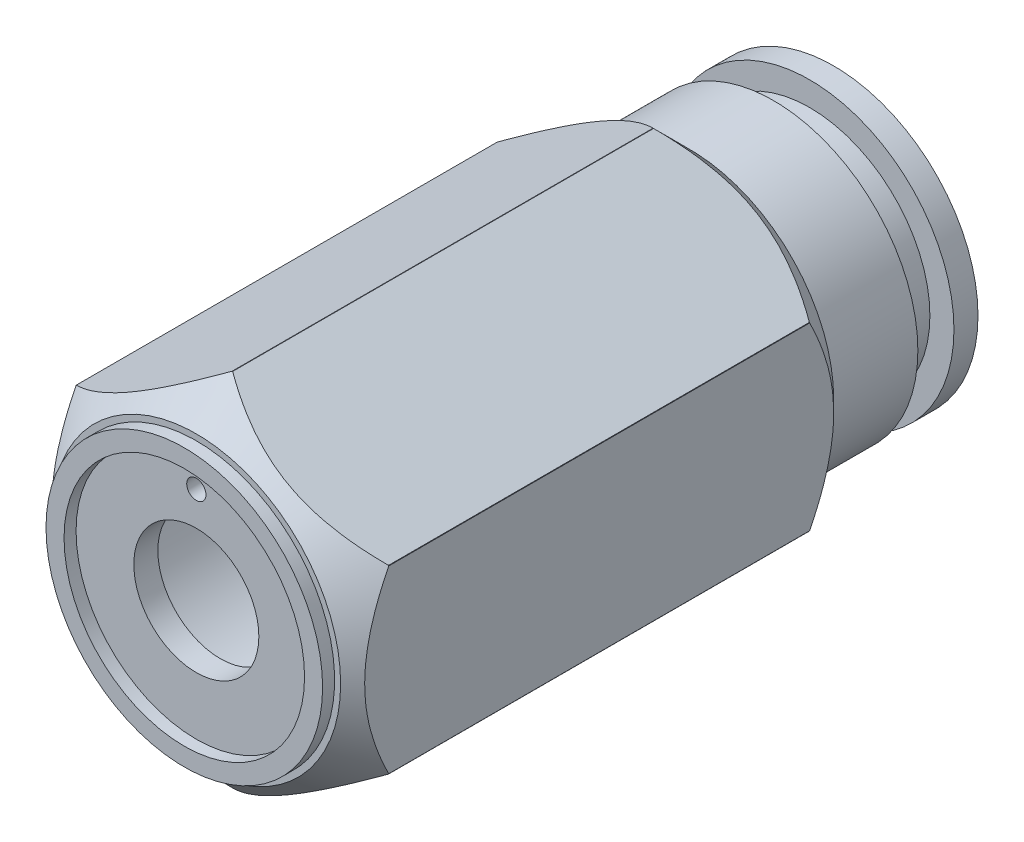
ISO-10303-21;
HEADER;
FILE_DESCRIPTION(('STEP AP214'),'2;1');
FILE_NAME('part.step','',(''),(''),'','','');
FILE_SCHEMA(('AUTOMOTIVE_DESIGN { 1 0 10303 214 1 1 1 1 }'));
ENDSEC;
DATA;
#1=APPLICATION_CONTEXT('core data for automotive mechanical design processes');
#2=APPLICATION_PROTOCOL_DEFINITION('international standard','automotive_design',2000,#1);
#3=PRODUCT_CONTEXT('',#1,'mechanical');
#4=PRODUCT('Part','Part','',(#3));
#5=PRODUCT_RELATED_PRODUCT_CATEGORY('part','',(#4));
#6=PRODUCT_DEFINITION_FORMATION('','',#4);
#7=PRODUCT_DEFINITION_CONTEXT('part definition',#1,'design');
#8=PRODUCT_DEFINITION('design','',#6,#7);
#9=PRODUCT_DEFINITION_SHAPE('','',#8);
#10=(LENGTH_UNIT() NAMED_UNIT(*) SI_UNIT(.MILLI.,.METRE.));
#11=(NAMED_UNIT(*) PLANE_ANGLE_UNIT() SI_UNIT($,.RADIAN.));
#12=(NAMED_UNIT(*) SI_UNIT($,.STERADIAN.) SOLID_ANGLE_UNIT());
#13=UNCERTAINTY_MEASURE_WITH_UNIT(LENGTH_MEASURE(1.E-05),#10,'distance_accuracy_value','');
#14=(GEOMETRIC_REPRESENTATION_CONTEXT(3) GLOBAL_UNCERTAINTY_ASSIGNED_CONTEXT((#13)) GLOBAL_UNIT_ASSIGNED_CONTEXT((#10,
#11,#12)) REPRESENTATION_CONTEXT('',''));
#15=CARTESIAN_POINT('',(0.,0.,0.));
#16=DIRECTION('',(0.,0.,1.));
#17=DIRECTION('',(1.,0.,0.));
#18=AXIS2_PLACEMENT_3D('',#15,#16,#17);
#19=CARTESIAN_POINT('',(0.,6.,-6.));
#20=DIRECTION('',(0.,0.,1.));
#21=DIRECTION('',(1.,0.,0.));
#22=AXIS2_PLACEMENT_3D('',#19,#20,#21);
#23=PLANE('',#22);
#24=CARTESIAN_POINT('',(0.,0.,-6.));
#25=DIRECTION('',(0.,0.,-1.));
#26=DIRECTION('',(-1.,0.,0.));
#27=AXIS2_PLACEMENT_3D('',#24,#25,#26);
#28=CIRCLE('',#27,2.5);
#29=CARTESIAN_POINT('',(-2.5,0.,-6.));
#30=VERTEX_POINT('',#29);
#31=EDGE_CURVE('E285',#30,#30,#28,.T.);
#32=ORIENTED_EDGE('',*,*,#31,.F.);
#33=EDGE_LOOP('',(#32));
#34=FACE_BOUND('',#33,.T.);
#35=CARTESIAN_POINT('',(0.,0.,-6.));
#36=DIRECTION('',(0.,0.,1.));
#37=DIRECTION('',(1.,0.,0.));
#38=AXIS2_PLACEMENT_3D('',#35,#36,#37);
#39=CIRCLE('',#38,6.);
#40=CARTESIAN_POINT('',(-6.,0.,-6.));
#41=VERTEX_POINT('',#40);
#42=EDGE_CURVE('E300',#41,#41,#39,.T.);
#43=ORIENTED_EDGE('',*,*,#42,.F.);
#44=EDGE_LOOP('',(#43));
#45=FACE_BOUND('',#44,.T.);
#46=ADVANCED_FACE('F16',(#34,#45),#23,.F.);
#47=CARTESIAN_POINT('',(0.,5.,-5.));
#48=DIRECTION('',(0.,0.,-1.));
#49=DIRECTION('',(0.,-1.,0.));
#50=AXIS2_PLACEMENT_3D('',#47,#48,#49);
#51=PLANE('',#50);
#52=CARTESIAN_POINT('',(0.,0.,-5.));
#53=DIRECTION('',(0.,0.,1.));
#54=DIRECTION('',(1.,0.,0.));
#55=AXIS2_PLACEMENT_3D('',#52,#53,#54);
#56=CIRCLE('',#55,5.);
#57=CARTESIAN_POINT('',(-5.,0.,-5.));
#58=VERTEX_POINT('',#57);
#59=EDGE_CURVE('E283',#58,#58,#56,.T.);
#60=ORIENTED_EDGE('',*,*,#59,.F.);
#61=EDGE_LOOP('',(#60));
#62=FACE_BOUND('',#61,.T.);
#63=CARTESIAN_POINT('',(0.,0.,-5.));
#64=DIRECTION('',(0.,0.,1.));
#65=DIRECTION('',(1.,0.,0.));
#66=AXIS2_PLACEMENT_3D('',#63,#64,#65);
#67=CIRCLE('',#66,6.);
#68=CARTESIAN_POINT('',(6.,0.,-5.));
#69=VERTEX_POINT('',#68);
#70=EDGE_CURVE('E286',#69,#69,#67,.T.);
#71=ORIENTED_EDGE('',*,*,#70,.T.);
#72=EDGE_LOOP('',(#71));
#73=FACE_BOUND('',#72,.T.);
#74=ADVANCED_FACE('F800',(#62,#73),#51,.F.);
#75=CARTESIAN_POINT('',(0.,6.,-3.5));
#76=DIRECTION('',(0.,0.,1.));
#77=DIRECTION('',(1.,0.,0.));
#78=AXIS2_PLACEMENT_3D('',#75,#76,#77);
#79=PLANE('',#78);
#80=CARTESIAN_POINT('',(0.,0.,-3.5));
#81=DIRECTION('',(0.,0.,1.));
#82=DIRECTION('',(1.,0.,0.));
#83=AXIS2_PLACEMENT_3D('',#80,#81,#82);
#84=CIRCLE('',#83,5.);
#85=CARTESIAN_POINT('',(5.,0.,-3.5));
#86=VERTEX_POINT('',#85);
#87=EDGE_CURVE('E251',#86,#86,#84,.T.);
#88=ORIENTED_EDGE('',*,*,#87,.T.);
#89=EDGE_LOOP('',(#88));
#90=FACE_BOUND('',#89,.T.);
#91=CARTESIAN_POINT('',(0.,0.,-3.5));
#92=DIRECTION('',(0.,0.,1.));
#93=DIRECTION('',(1.,0.,0.));
#94=AXIS2_PLACEMENT_3D('',#91,#92,#93);
#95=CIRCLE('',#94,6.);
#96=CARTESIAN_POINT('',(-6.,0.,-3.5));
#97=VERTEX_POINT('',#96);
#98=EDGE_CURVE('E242',#97,#97,#95,.T.);
#99=ORIENTED_EDGE('',*,*,#98,.F.);
#100=EDGE_LOOP('',(#99));
#101=FACE_BOUND('',#100,.T.);
#102=ADVANCED_FACE('F791',(#90,#101),#79,.F.);
#103=CARTESIAN_POINT('',(0.,-7.50555349946513,20.5));
#104=DIRECTION('',(0.5,0.866025403784438,0.));
#105=DIRECTION('',(0.,0.,-1.));
#106=AXIS2_PLACEMENT_3D('',#103,#104,#105);
#107=PLANE('',#106);
#108=CARTESIAN_POINT('',(-0.0096296507960727,-7.49999381798581,19.));
#109=CARTESIAN_POINT('',(-0.828912052166388,-7.02698090301234,19.4719606046267));
#110=CARTESIAN_POINT('',(-1.57034631152404,-6.59891363378579,19.7168113188353));
#111=CARTESIAN_POINT('',(-2.4215834395052,-6.10745164880166,19.9979232530581));
#112=CARTESIAN_POINT('',(-3.23817168564602,-5.63599420507518,19.9999856503727));
#113=CARTESIAN_POINT('',(-4.05526989250544,-5.16424233539053,20.002049335658));
#114=CARTESIAN_POINT('',(-4.90801836544974,-4.67190777498509,19.7239121512809));
#115=CARTESIAN_POINT('',(-5.65882494445944,-4.2384293944845,19.4790249019652));
#116=CARTESIAN_POINT('',(-6.49037034920392,-3.75833643121187,19.));
#117=B_SPLINE_CURVE_WITH_KNOTS('',2,(#108,#109,#110,#111,#112,#113,#114,#115,#116),
.UNSPECIFIED.,.F.,.F.,(3,2,2,2,3),(0.,0.25,0.5,0.75,1.),.UNSPECIFIED.);
#118=CARTESIAN_POINT('',(-0.0096296507960743,-7.49999381798582,19.));
#119=VERTEX_POINT('',#118);
#120=CARTESIAN_POINT('',(-6.49037034920393,-3.75833643121187,19.));
#121=VERTEX_POINT('',#120);
#122=EDGE_CURVE('E615',#119,#121,#117,.T.);
#123=ORIENTED_EDGE('',*,*,#122,.T.);
#124=DIRECTION('',(0.,0.,1.));
#125=VECTOR('',#124,1.);
#126=CARTESIAN_POINT('',(-6.49037034920393,-3.75833643121187,20.5));
#127=LINE('',#126,#125);
#128=CARTESIAN_POINT('',(-6.49037034920394,-3.75833643121187,1.5));
#129=VERTEX_POINT('',#128);
#130=EDGE_CURVE('E11',#129,#121,#127,.T.);
#131=ORIENTED_EDGE('',*,*,#130,.F.);
#132=CARTESIAN_POINT('',(-6.49037034920393,-3.75833643121187,1.5));
#133=CARTESIAN_POINT('',(-5.67108794781167,-4.23134934619801,1.0280393953607));
#134=CARTESIAN_POINT('',(-4.92965368847596,-4.6594166154119,0.783188681164702));
#135=CARTESIAN_POINT('',(-4.078416560476,-5.15087860040688,0.502076746941901));
#136=CARTESIAN_POINT('',(-3.26182831435399,-5.62233604412251,0.500014349627303));
#137=CARTESIAN_POINT('',(-2.4447301075046,-6.09408791380136,0.497950664342099));
#138=CARTESIAN_POINT('',(-1.59198163455027,-6.58642247421259,0.776087848719048));
#139=CARTESIAN_POINT('',(-0.841175055552183,-7.01990085470648,1.02097509802805));
#140=CARTESIAN_POINT('',(-0.00962965079607135,-7.49999381798582,1.5));
#141=B_SPLINE_CURVE_WITH_KNOTS('',2,(#132,#133,#134,#135,#136,#137,#138,#139,#140),
.UNSPECIFIED.,.F.,.F.,(3,2,2,2,3),(0.,0.25,0.5,0.75,1.),.UNSPECIFIED.);
#142=CARTESIAN_POINT('',(-0.00962965079607205,-7.49999381798582,1.5));
#143=VERTEX_POINT('',#142);
#144=EDGE_CURVE('E524',#129,#143,#141,.T.);
#145=ORIENTED_EDGE('',*,*,#144,.T.);
#146=DIRECTION('',(0.,0.,-1.));
#147=VECTOR('',#146,1.);
#148=CARTESIAN_POINT('',(-0.0096296507960743,-7.49999381798582,20.5));
#149=LINE('',#148,#147);
#150=EDGE_CURVE('E303',#119,#143,#149,.T.);
#151=ORIENTED_EDGE('',*,*,#150,.F.);
#152=EDGE_LOOP('',(#123,#131,#145,#151));
#153=FACE_BOUND('',#152,.T.);
#154=ADVANCED_FACE('F797',(#153),#107,.F.);
#155=CARTESIAN_POINT('',(0.,0.,20.5));
#156=DIRECTION('',(0.,0.,-1.));
#157=DIRECTION('',(-1.,0.,0.));
#158=AXIS2_PLACEMENT_3D('',#155,#156,#157);
#159=CYLINDRICAL_SURFACE('',#158,7.5);
#160=CARTESIAN_POINT('',(0.,0.,1.5));
#161=DIRECTION('',(0.,0.,1.));
#162=DIRECTION('',(1.,0.,0.));
#163=AXIS2_PLACEMENT_3D('',#160,#161,#162);
#164=CIRCLE('',#163,7.5);
#165=CARTESIAN_POINT('',(-6.5,-3.74165738677395,1.5));
#166=VERTEX_POINT('',#165);
#167=EDGE_CURVE('E519',#166,#129,#164,.T.);
#168=ORIENTED_EDGE('',*,*,#167,.T.);
#169=ORIENTED_EDGE('',*,*,#130,.T.);
#170=CARTESIAN_POINT('',(0.,0.,19.));
#171=DIRECTION('',(0.,0.,-1.));
#172=DIRECTION('',(1.,0.,0.));
#173=AXIS2_PLACEMENT_3D('',#170,#171,#172);
#174=CIRCLE('',#173,7.5);
#175=CARTESIAN_POINT('',(-6.5,-3.74165738677395,19.));
#176=VERTEX_POINT('',#175);
#177=EDGE_CURVE('E518',#121,#176,#174,.T.);
#178=ORIENTED_EDGE('',*,*,#177,.T.);
#179=DIRECTION('',(0.,0.,-1.));
#180=VECTOR('',#179,1.);
#181=CARTESIAN_POINT('',(-6.5,-3.74165738677395,20.5));
#182=LINE('',#181,#180);
#183=EDGE_CURVE('E26',#176,#166,#182,.T.);
#184=ORIENTED_EDGE('',*,*,#183,.T.);
#185=EDGE_LOOP('',(#168,#169,#178,#184));
#186=FACE_BOUND('',#185,.T.);
#187=ADVANCED_FACE('F836',(#186),#159,.T.);
#188=CARTESIAN_POINT('',(-6.5,-3.75277674973256,20.5));
#189=DIRECTION('',(1.,0.,0.));
#190=DIRECTION('',(0.,1.,0.));
#191=AXIS2_PLACEMENT_3D('',#188,#189,#190);
#192=PLANE('',#191);
#193=CARTESIAN_POINT('',(-6.5,-3.74165738677395,19.));
#194=CARTESIAN_POINT('',(-6.5,-2.78837203152614,19.4755822921555));
#195=CARTESIAN_POINT('',(-6.5,-1.92613583685732,19.7206195517565));
#196=CARTESIAN_POINT('',(-6.5,-0.943052958153085,20.));
#197=CARTESIAN_POINT('',(-6.5,0.,20.));
#198=B_SPLINE_CURVE_WITH_KNOTS('',2,(#193,#194,#195,#196,#197),.UNSPECIFIED.,.F.,.F.,(3,2,3),
(0.,0.5,1.),.UNSPECIFIED.);
#199=CARTESIAN_POINT('',(-6.5,0.,20.));
#200=VERTEX_POINT('',#199);
#201=EDGE_CURVE('E513',#176,#200,#198,.T.);
#202=ORIENTED_EDGE('',*,*,#201,.T.);
#203=CARTESIAN_POINT('',(-6.5,0.,20.));
#204=CARTESIAN_POINT('',(-6.5,0.942559457346275,20.));
#205=CARTESIAN_POINT('',(-6.5,1.92613782088363,19.7206189880611));
#206=CARTESIAN_POINT('',(-6.5,2.78779977404503,19.4758677843463));
#207=CARTESIAN_POINT('',(-6.5,3.74165738677394,19.));
#208=B_SPLINE_CURVE_WITH_KNOTS('',2,(#203,#204,#205,#206,#207),.UNSPECIFIED.,.F.,.F.,(3,2,3),
(0.,0.5,1.),.UNSPECIFIED.);
#209=CARTESIAN_POINT('',(-6.5,3.74165738677395,19.));
#210=VERTEX_POINT('',#209);
#211=EDGE_CURVE('E274',#200,#210,#208,.T.);
#212=ORIENTED_EDGE('',*,*,#211,.T.);
#213=DIRECTION('',(0.,0.,1.));
#214=VECTOR('',#213,1.);
#215=CARTESIAN_POINT('',(-6.5,3.74165738677395,20.5));
#216=LINE('',#215,#214);
#217=CARTESIAN_POINT('',(-6.5,3.74165738677395,1.5));
#218=VERTEX_POINT('',#217);
#219=EDGE_CURVE('E586',#218,#210,#216,.T.);
#220=ORIENTED_EDGE('',*,*,#219,.F.);
#221=CARTESIAN_POINT('',(-6.5,3.74165738677394,1.5));
#222=CARTESIAN_POINT('',(-6.5,2.78837517871614,1.0244192779387));
#223=CARTESIAN_POINT('',(-6.5,1.92613782088361,0.779381011938952));
#224=CARTESIAN_POINT('',(-6.5,0.943055670102145,0.5));
#225=CARTESIAN_POINT('',(-6.5,0.,0.5));
#226=B_SPLINE_CURVE_WITH_KNOTS('',2,(#221,#222,#223,#224,#225),.UNSPECIFIED.,.F.,.F.,(3,2,3),
(0.,0.5,1.),.UNSPECIFIED.);
#227=CARTESIAN_POINT('',(-6.5,0.,0.5));
#228=VERTEX_POINT('',#227);
#229=EDGE_CURVE('E651',#218,#228,#226,.T.);
#230=ORIENTED_EDGE('',*,*,#229,.T.);
#231=CARTESIAN_POINT('',(-6.5,0.,0.5));
#232=CARTESIAN_POINT('',(-6.5,-0.942560930474805,0.5));
#233=CARTESIAN_POINT('',(-6.5,-1.92613583685731,0.779380448243501));
#234=CARTESIAN_POINT('',(-6.5,-2.78780147904892,1.024133066259));
#235=CARTESIAN_POINT('',(-6.5,-3.74165738677395,1.5));
#236=B_SPLINE_CURVE_WITH_KNOTS('',2,(#231,#232,#233,#234,#235),.UNSPECIFIED.,.F.,.F.,(3,2,3),
(0.,0.5,1.),.UNSPECIFIED.);
#237=EDGE_CURVE('E522',#228,#166,#236,.T.);
#238=ORIENTED_EDGE('',*,*,#237,.T.);
#239=ORIENTED_EDGE('',*,*,#183,.F.);
#240=EDGE_LOOP('',(#202,#212,#220,#230,#238,#239));
#241=FACE_BOUND('',#240,.T.);
#242=ADVANCED_FACE('F844',(#241),#192,.F.);
#243=CARTESIAN_POINT('',(0.,0.,20.5));
#244=DIRECTION('',(0.,0.,-1.));
#245=DIRECTION('',(-1.,0.,0.));
#246=AXIS2_PLACEMENT_3D('',#243,#244,#245);
#247=CYLINDRICAL_SURFACE('',#246,7.5);
#248=CARTESIAN_POINT('',(0.,0.,19.));
#249=DIRECTION('',(0.,0.,-1.));
#250=DIRECTION('',(1.,0.,0.));
#251=AXIS2_PLACEMENT_3D('',#248,#249,#250);
#252=CIRCLE('',#251,7.5);
#253=CARTESIAN_POINT('',(-6.49037034920393,3.75833643121187,19.));
#254=VERTEX_POINT('',#253);
#255=EDGE_CURVE('E293',#210,#254,#252,.T.);
#256=ORIENTED_EDGE('',*,*,#255,.T.);
#257=DIRECTION('',(0.,0.,-1.));
#258=VECTOR('',#257,1.);
#259=CARTESIAN_POINT('',(-6.49037034920393,3.75833643121187,20.5));
#260=LINE('',#259,#258);
#261=CARTESIAN_POINT('',(-6.49037034920393,3.75833643121187,1.5));
#262=VERTEX_POINT('',#261);
#263=EDGE_CURVE('E193',#254,#262,#260,.T.);
#264=ORIENTED_EDGE('',*,*,#263,.T.);
#265=CARTESIAN_POINT('',(0.,0.,1.5));
#266=DIRECTION('',(0.,0.,1.));
#267=DIRECTION('',(1.,0.,0.));
#268=AXIS2_PLACEMENT_3D('',#265,#266,#267);
#269=CIRCLE('',#268,7.5);
#270=EDGE_CURVE('E351',#262,#218,#269,.T.);
#271=ORIENTED_EDGE('',*,*,#270,.T.);
#272=ORIENTED_EDGE('',*,*,#219,.T.);
#273=EDGE_LOOP('',(#256,#264,#271,#272));
#274=FACE_BOUND('',#273,.T.);
#275=ADVANCED_FACE('F18',(#274),#247,.T.);
#276=CARTESIAN_POINT('',(-6.5,3.75277674973256,20.5));
#277=DIRECTION('',(0.5,-0.866025403784439,0.));
#278=DIRECTION('',(0.,0.,-1.));
#279=AXIS2_PLACEMENT_3D('',#276,#277,#278);
#280=PLANE('',#279);
#281=CARTESIAN_POINT('',(-6.49037034920394,3.75833643121187,19.));
#282=CARTESIAN_POINT('',(-5.67108794782176,4.2313493461922,19.4719606046335));
#283=CARTESIAN_POINT('',(-4.92965368847596,4.6594166154119,19.7168113188353));
#284=CARTESIAN_POINT('',(-4.07841656048468,5.15087860040188,19.9979232530581));
#285=CARTESIAN_POINT('',(-3.26182831435399,5.62233604412252,19.9999856503727));
#286=CARTESIAN_POINT('',(-2.44473010749523,6.09408791380678,20.0020493356579));
#287=CARTESIAN_POINT('',(-1.59198163455027,6.58642247421259,19.7239121512809));
#288=CARTESIAN_POINT('',(-0.841175055541357,7.01990085471273,19.4790249019657));
#289=CARTESIAN_POINT('',(-0.00962965079606692,7.49999381798582,19.));
#290=B_SPLINE_CURVE_WITH_KNOTS('',2,(#281,#282,#283,#284,#285,#286,#287,#288,#289),
.UNSPECIFIED.,.F.,.F.,(3,2,2,2,3),(0.,0.25,0.5,0.75,1.),.UNSPECIFIED.);
#291=CARTESIAN_POINT('',(-0.00962965079606172,7.49999381798582,19.));
#292=VERTEX_POINT('',#291);
#293=EDGE_CURVE('E306',#254,#292,#290,.T.);
#294=ORIENTED_EDGE('',*,*,#293,.T.);
#295=DIRECTION('',(0.,0.,1.));
#296=VECTOR('',#295,1.);
#297=CARTESIAN_POINT('',(-0.00962965079606172,7.49999381798582,20.5));
#298=LINE('',#297,#296);
#299=CARTESIAN_POINT('',(-0.00962965079606649,7.49999381798582,1.5));
#300=VERTEX_POINT('',#299);
#301=EDGE_CURVE('E182',#300,#292,#298,.T.);
#302=ORIENTED_EDGE('',*,*,#301,.F.);
#303=CARTESIAN_POINT('',(-0.00962965079606692,7.49999381798582,1.5));
#304=CARTESIAN_POINT('',(-0.828912052190848,7.02698090299822,1.02803939535925));
#305=CARTESIAN_POINT('',(-1.57034631152404,6.59891363378579,0.783188681164702));
#306=CARTESIAN_POINT('',(-2.42158343953541,6.10745164878422,0.502076746938852));
#307=CARTESIAN_POINT('',(-3.23817168564602,5.63599420507518,0.500014349627303));
#308=CARTESIAN_POINT('',(-4.05526989251348,5.16424233538589,0.497950664345052));
#309=CARTESIAN_POINT('',(-4.90801836544974,4.6719077749851,0.776087848719048));
#310=CARTESIAN_POINT('',(-5.6588249444581,4.23842939448528,1.020975098034));
#311=CARTESIAN_POINT('',(-6.49037034920394,3.75833643121187,1.5));
#312=B_SPLINE_CURVE_WITH_KNOTS('',2,(#303,#304,#305,#306,#307,#308,#309,#310,#311),
.UNSPECIFIED.,.F.,.F.,(3,2,2,2,3),(0.,0.25,0.5,0.75,1.),.UNSPECIFIED.);
#313=EDGE_CURVE('E350',#300,#262,#312,.T.);
#314=ORIENTED_EDGE('',*,*,#313,.T.);
#315=ORIENTED_EDGE('',*,*,#263,.F.);
#316=EDGE_LOOP('',(#294,#302,#314,#315));
#317=FACE_BOUND('',#316,.T.);
#318=ADVANCED_FACE('F317',(#317),#280,.F.);
#319=CARTESIAN_POINT('',(0.,0.,20.5));
#320=DIRECTION('',(0.,0.,-1.));
#321=DIRECTION('',(-1.,0.,0.));
#322=AXIS2_PLACEMENT_3D('',#319,#320,#321);
#323=CYLINDRICAL_SURFACE('',#322,7.5);
#324=CARTESIAN_POINT('',(0.,0.,19.));
#325=DIRECTION('',(0.,0.,-1.));
#326=DIRECTION('',(1.,4.06785716222658E-13,0.));
#327=AXIS2_PLACEMENT_3D('',#324,#325,#326);
#328=CIRCLE('',#327,7.5);
#329=CARTESIAN_POINT('',(0.00962965079606822,7.49999381798582,19.));
#330=VERTEX_POINT('',#329);
#331=EDGE_CURVE('E536',#292,#330,#328,.T.);
#332=ORIENTED_EDGE('',*,*,#331,.T.);
#333=DIRECTION('',(0.,0.,-1.));
#334=VECTOR('',#333,1.);
#335=CARTESIAN_POINT('',(0.00962965079606822,7.49999381798582,20.5));
#336=LINE('',#335,#334);
#337=CARTESIAN_POINT('',(0.00962965079606612,7.49999381798582,1.5));
#338=VERTEX_POINT('',#337);
#339=EDGE_CURVE('E626',#330,#338,#336,.T.);
#340=ORIENTED_EDGE('',*,*,#339,.T.);
#341=CARTESIAN_POINT('',(0.,0.,1.5));
#342=DIRECTION('',(0.,0.,1.));
#343=DIRECTION('',(1.,0.,0.));
#344=AXIS2_PLACEMENT_3D('',#341,#342,#343);
#345=CIRCLE('',#344,7.5);
#346=EDGE_CURVE('E596',#338,#300,#345,.T.);
#347=ORIENTED_EDGE('',*,*,#346,.T.);
#348=ORIENTED_EDGE('',*,*,#301,.T.);
#349=EDGE_LOOP('',(#332,#340,#347,#348));
#350=FACE_BOUND('',#349,.T.);
#351=ADVANCED_FACE('F327',(#350),#323,.T.);
#352=CARTESIAN_POINT('',(0.,7.50555349946513,20.5));
#353=DIRECTION('',(-0.5,-0.866025403784439,0.));
#354=DIRECTION('',(-0.866025403784439,0.5,0.));
#355=AXIS2_PLACEMENT_3D('',#352,#353,#354);
#356=PLANE('',#355);
#357=CARTESIAN_POINT('',(0.00962965079606796,7.49999381798582,19.));
#358=CARTESIAN_POINT('',(0.828912052177772,7.02698090300577,19.4719606046332));
#359=CARTESIAN_POINT('',(1.57034631152404,6.59891363378579,19.7168113188353));
#360=CARTESIAN_POINT('',(2.42158343952416,6.10745164879072,19.9979232530611));
#361=CARTESIAN_POINT('',(3.23817168564601,5.63599420507518,19.9999856503727));
#362=CARTESIAN_POINT('',(4.0552698925133,5.16424233538599,20.0020493356549));
#363=CARTESIAN_POINT('',(4.90801836544974,4.67190777498509,19.7239121512809));
#364=CARTESIAN_POINT('',(5.65882494445791,4.23842939448538,19.4790249019661));
#365=CARTESIAN_POINT('',(6.49037034920393,3.75833643121187,19.));
#366=B_SPLINE_CURVE_WITH_KNOTS('',2,(#357,#358,#359,#360,#361,#362,#363,#364,#365),
.UNSPECIFIED.,.F.,.F.,(3,2,2,2,3),(0.,0.25,0.5,0.75,1.),.UNSPECIFIED.);
#367=CARTESIAN_POINT('',(6.49037034920393,3.75833643121187,19.));
#368=VERTEX_POINT('',#367);
#369=EDGE_CURVE('E544',#330,#368,#366,.T.);
#370=ORIENTED_EDGE('',*,*,#369,.T.);
#371=DIRECTION('',(0.,0.,1.));
#372=VECTOR('',#371,1.);
#373=CARTESIAN_POINT('',(6.49037034920393,3.75833643121187,20.5));
#374=LINE('',#373,#372);
#375=CARTESIAN_POINT('',(6.49037034920394,3.75833643121187,1.5));
#376=VERTEX_POINT('',#375);
#377=EDGE_CURVE('E494',#376,#368,#374,.T.);
#378=ORIENTED_EDGE('',*,*,#377,.F.);
#379=CARTESIAN_POINT('',(6.49037034920394,3.75833643121187,1.49999999999999));
#380=CARTESIAN_POINT('',(5.67108794782093,4.23134934619268,1.02803939536604));
#381=CARTESIAN_POINT('',(4.92965368847597,4.6594166154119,0.783188681164691));
#382=CARTESIAN_POINT('',(4.07841656048399,5.15087860040227,0.502076746941939));
#383=CARTESIAN_POINT('',(3.26182831435399,5.62233604412251,0.500014349627292));
#384=CARTESIAN_POINT('',(2.44473010749558,6.09408791380657,0.49795066434204));
#385=CARTESIAN_POINT('',(1.59198163455027,6.58642247421259,0.776087848719038));
#386=CARTESIAN_POINT('',(0.841175055541698,7.01990085471253,1.0209750980341));
#387=CARTESIAN_POINT('',(0.00962965079606642,7.49999381798582,1.49999999999999));
#388=B_SPLINE_CURVE_WITH_KNOTS('',2,(#379,#380,#381,#382,#383,#384,#385,#386,#387),
.UNSPECIFIED.,.F.,.F.,(3,2,2,2,3),(0.,0.25,0.5,0.75,1.),.UNSPECIFIED.);
#389=EDGE_CURVE('E594',#376,#338,#388,.T.);
#390=ORIENTED_EDGE('',*,*,#389,.T.);
#391=ORIENTED_EDGE('',*,*,#339,.F.);
#392=EDGE_LOOP('',(#370,#378,#390,#391));
#393=FACE_BOUND('',#392,.T.);
#394=ADVANCED_FACE('F871',(#393),#356,.F.);
#395=CARTESIAN_POINT('',(0.,0.,20.5));
#396=DIRECTION('',(0.,0.,-1.));
#397=DIRECTION('',(-1.,0.,0.));
#398=AXIS2_PLACEMENT_3D('',#395,#396,#397);
#399=CYLINDRICAL_SURFACE('',#398,7.5);
#400=CARTESIAN_POINT('',(0.,0.,19.));
#401=DIRECTION('',(0.,0.,-1.));
#402=DIRECTION('',(1.,4.9826809345177E-13,0.));
#403=AXIS2_PLACEMENT_3D('',#400,#401,#402);
#404=CIRCLE('',#403,7.5);
#405=CARTESIAN_POINT('',(6.5,3.74165738677395,19.));
#406=VERTEX_POINT('',#405);
#407=EDGE_CURVE('E533',#368,#406,#404,.T.);
#408=ORIENTED_EDGE('',*,*,#407,.T.);
#409=DIRECTION('',(0.,0.,-1.));
#410=VECTOR('',#409,1.);
#411=CARTESIAN_POINT('',(6.5,3.74165738677395,20.5));
#412=LINE('',#411,#410);
#413=CARTESIAN_POINT('',(6.5,3.74165738677395,1.5));
#414=VERTEX_POINT('',#413);
#415=EDGE_CURVE('E489',#406,#414,#412,.T.);
#416=ORIENTED_EDGE('',*,*,#415,.T.);
#417=CARTESIAN_POINT('',(0.,0.,1.5));
#418=DIRECTION('',(0.,0.,1.));
#419=DIRECTION('',(1.,0.,0.));
#420=AXIS2_PLACEMENT_3D('',#417,#418,#419);
#421=CIRCLE('',#420,7.5);
#422=EDGE_CURVE('E278',#414,#376,#421,.T.);
#423=ORIENTED_EDGE('',*,*,#422,.T.);
#424=ORIENTED_EDGE('',*,*,#377,.T.);
#425=EDGE_LOOP('',(#408,#416,#423,#424));
#426=FACE_BOUND('',#425,.T.);
#427=ADVANCED_FACE('F423',(#426),#399,.T.);
#428=CARTESIAN_POINT('',(6.5,3.75277674973256,20.5));
#429=DIRECTION('',(-1.,0.,0.));
#430=DIRECTION('',(0.,0.,1.));
#431=AXIS2_PLACEMENT_3D('',#428,#429,#430);
#432=PLANE('',#431);
#433=CARTESIAN_POINT('',(6.5,3.74165738677395,19.));
#434=CARTESIAN_POINT('',(6.5,2.78837517872898,19.4755807220549));
#435=CARTESIAN_POINT('',(6.5,1.92613782088362,19.7206189880611));
#436=CARTESIAN_POINT('',(6.5,0.943055670113235,20.));
#437=CARTESIAN_POINT('',(6.5,0.,20.));
#438=B_SPLINE_CURVE_WITH_KNOTS('',2,(#433,#434,#435,#436,#437),.UNSPECIFIED.,.F.,.F.,(3,2,3),
(0.,0.5,1.),.UNSPECIFIED.);
#439=CARTESIAN_POINT('',(6.5,0.,20.));
#440=VERTEX_POINT('',#439);
#441=EDGE_CURVE('E529',#406,#440,#438,.T.);
#442=ORIENTED_EDGE('',*,*,#441,.T.);
#443=CARTESIAN_POINT('',(6.5,0.,20.));
#444=CARTESIAN_POINT('',(6.5,-0.942560930474175,20.));
#445=CARTESIAN_POINT('',(6.5,-1.92613583685732,19.7206195517565));
#446=CARTESIAN_POINT('',(6.5,-2.78780147904814,19.4758669337414));
#447=CARTESIAN_POINT('',(6.5,-3.74165738677394,19.));
#448=B_SPLINE_CURVE_WITH_KNOTS('',2,(#443,#444,#445,#446,#447),.UNSPECIFIED.,.F.,.F.,(3,2,3),
(0.,0.5,1.),.UNSPECIFIED.);
#449=CARTESIAN_POINT('',(6.5,-3.74165738677395,19.));
#450=VERTEX_POINT('',#449);
#451=EDGE_CURVE('E534',#440,#450,#448,.T.);
#452=ORIENTED_EDGE('',*,*,#451,.T.);
#453=DIRECTION('',(0.,0.,1.));
#454=VECTOR('',#453,1.);
#455=CARTESIAN_POINT('',(6.5,-3.74165738677395,20.5));
#456=LINE('',#455,#454);
#457=CARTESIAN_POINT('',(6.5,-3.74165738677395,1.5));
#458=VERTEX_POINT('',#457);
#459=EDGE_CURVE('E467',#458,#450,#456,.T.);
#460=ORIENTED_EDGE('',*,*,#459,.F.);
#461=CARTESIAN_POINT('',(6.5,-3.74165738677394,1.5));
#462=CARTESIAN_POINT('',(6.5,-2.78837203152661,1.0244177078447));
#463=CARTESIAN_POINT('',(6.5,-1.92613583685731,0.779380448243501));
#464=CARTESIAN_POINT('',(6.5,-0.943052958153506,0.5));
#465=CARTESIAN_POINT('',(6.5,0.,0.5));
#466=B_SPLINE_CURVE_WITH_KNOTS('',2,(#461,#462,#463,#464,#465),.UNSPECIFIED.,.F.,.F.,(3,2,3),
(0.,0.5,1.),.UNSPECIFIED.);
#467=CARTESIAN_POINT('',(6.5,0.,0.5));
#468=VERTEX_POINT('',#467);
#469=EDGE_CURVE('E248',#458,#468,#466,.T.);
#470=ORIENTED_EDGE('',*,*,#469,.T.);
#471=CARTESIAN_POINT('',(6.5,0.,0.5));
#472=CARTESIAN_POINT('',(6.5,0.942559457346085,0.5));
#473=CARTESIAN_POINT('',(6.5,1.92613782088362,0.779381011938952));
#474=CARTESIAN_POINT('',(6.5,2.78779977404496,1.0241322156536));
#475=CARTESIAN_POINT('',(6.5,3.74165738677395,1.5));
#476=B_SPLINE_CURVE_WITH_KNOTS('',2,(#471,#472,#473,#474,#475),.UNSPECIFIED.,.F.,.F.,(3,2,3),
(0.,0.5,1.),.UNSPECIFIED.);
#477=EDGE_CURVE('E241',#468,#414,#476,.T.);
#478=ORIENTED_EDGE('',*,*,#477,.T.);
#479=ORIENTED_EDGE('',*,*,#415,.F.);
#480=EDGE_LOOP('',(#442,#452,#460,#470,#478,#479));
#481=FACE_BOUND('',#480,.T.);
#482=ADVANCED_FACE('F413',(#481),#432,.F.);
#483=CARTESIAN_POINT('',(0.,0.,20.5));
#484=DIRECTION('',(0.,0.,-1.));
#485=DIRECTION('',(-1.,0.,0.));
#486=AXIS2_PLACEMENT_3D('',#483,#484,#485);
#487=CYLINDRICAL_SURFACE('',#486,7.5);
#488=CARTESIAN_POINT('',(0.,0.,19.));
#489=DIRECTION('',(0.,0.,-1.));
#490=DIRECTION('',(1.,0.,0.));
#491=AXIS2_PLACEMENT_3D('',#488,#489,#490);
#492=CIRCLE('',#491,7.5);
#493=CARTESIAN_POINT('',(6.49037034920393,-3.75833643121188,19.));
#494=VERTEX_POINT('',#493);
#495=EDGE_CURVE('E567',#450,#494,#492,.T.);
#496=ORIENTED_EDGE('',*,*,#495,.T.);
#497=DIRECTION('',(0.,0.,-1.));
#498=VECTOR('',#497,1.);
#499=CARTESIAN_POINT('',(6.49037034920393,-3.75833643121188,20.5));
#500=LINE('',#499,#498);
#501=CARTESIAN_POINT('',(6.49037034920393,-3.75833643121188,1.5));
#502=VERTEX_POINT('',#501);
#503=EDGE_CURVE('E471',#494,#502,#500,.T.);
#504=ORIENTED_EDGE('',*,*,#503,.T.);
#505=CARTESIAN_POINT('',(0.,0.,1.5));
#506=DIRECTION('',(0.,0.,1.));
#507=DIRECTION('',(1.,0.,0.));
#508=AXIS2_PLACEMENT_3D('',#505,#506,#507);
#509=CIRCLE('',#508,7.5);
#510=EDGE_CURVE('E448',#502,#458,#509,.T.);
#511=ORIENTED_EDGE('',*,*,#510,.T.);
#512=ORIENTED_EDGE('',*,*,#459,.T.);
#513=EDGE_LOOP('',(#496,#504,#511,#512));
#514=FACE_BOUND('',#513,.T.);
#515=ADVANCED_FACE('F424',(#514),#487,.T.);
#516=CARTESIAN_POINT('',(6.5,-3.75277674973257,20.5));
#517=DIRECTION('',(-0.5,0.866025403784439,0.));
#518=DIRECTION('',(0.,0.,1.));
#519=AXIS2_PLACEMENT_3D('',#516,#517,#518);
#520=PLANE('',#519);
#521=CARTESIAN_POINT('',(6.49037034920393,-3.75833643121188,19.));
#522=CARTESIAN_POINT('',(5.67108794780871,-4.23134934619973,19.471960604641));
#523=CARTESIAN_POINT('',(4.92965368847596,-4.65941661541191,19.7168113188353));
#524=CARTESIAN_POINT('',(4.07841656047344,-5.15087860040837,19.9979232530581));
#525=CARTESIAN_POINT('',(3.26182831435399,-5.62233604412252,19.9999856503727));
#526=CARTESIAN_POINT('',(2.44473010750446,-6.09408791380145,20.0020493356579));
#527=CARTESIAN_POINT('',(1.59198163455027,-6.5864224742126,19.7239121512809));
#528=CARTESIAN_POINT('',(0.841175055551966,-7.01990085470661,19.4790249019718));
#529=CARTESIAN_POINT('',(0.00962965079607473,-7.49999381798582,19.));
#530=B_SPLINE_CURVE_WITH_KNOTS('',2,(#521,#522,#523,#524,#525,#526,#527,#528,#529),
.UNSPECIFIED.,.F.,.F.,(3,2,2,2,3),(0.,0.25,0.5,0.75,1.),.UNSPECIFIED.);
#531=CARTESIAN_POINT('',(0.00962965079607473,-7.49999381798582,19.));
#532=VERTEX_POINT('',#531);
#533=EDGE_CURVE('E573',#494,#532,#530,.T.);
#534=ORIENTED_EDGE('',*,*,#533,.T.);
#535=DIRECTION('',(0.,0.,1.));
#536=VECTOR('',#535,1.);
#537=CARTESIAN_POINT('',(0.00962965079607473,-7.49999381798582,20.5));
#538=LINE('',#537,#536);
#539=CARTESIAN_POINT('',(0.00962965079607386,-7.49999381798582,1.5));
#540=VERTEX_POINT('',#539);
#541=EDGE_CURVE('E472',#540,#532,#538,.T.);
#542=ORIENTED_EDGE('',*,*,#541,.F.);
#543=CARTESIAN_POINT('',(0.00962965079607473,-7.49999381798582,1.5));
#544=CARTESIAN_POINT('',(0.828912052177381,-7.026980903006,1.028039395367));
#545=CARTESIAN_POINT('',(1.57034631152404,-6.59891363378579,0.783188681164702));
#546=CARTESIAN_POINT('',(2.42158343951458,-6.10745164879625,0.50207674694195));
#547=CARTESIAN_POINT('',(3.23817168564602,-5.63599420507518,0.500014349627303));
#548=CARTESIAN_POINT('',(4.05526989249418,-5.16424233539704,0.497950664342099));
#549=CARTESIAN_POINT('',(4.90801836544974,-4.67190777498511,0.776087848719048));
#550=CARTESIAN_POINT('',(5.6588249444464,-4.23842939449204,1.02097509802725));
#551=CARTESIAN_POINT('',(6.49037034920393,-3.75833643121188,1.5));
#552=B_SPLINE_CURVE_WITH_KNOTS('',2,(#543,#544,#545,#546,#547,#548,#549,#550,#551),
.UNSPECIFIED.,.F.,.F.,(3,2,2,2,3),(0.,0.25,0.5,0.75,1.),.UNSPECIFIED.);
#553=EDGE_CURVE('E452',#540,#502,#552,.T.);
#554=ORIENTED_EDGE('',*,*,#553,.T.);
#555=ORIENTED_EDGE('',*,*,#503,.F.);
#556=EDGE_LOOP('',(#534,#542,#554,#555));
#557=FACE_BOUND('',#556,.T.);
#558=ADVANCED_FACE('F829',(#557),#520,.F.);
#559=CARTESIAN_POINT('',(0.,0.,20.5));
#560=DIRECTION('',(0.,0.,-1.));
#561=DIRECTION('',(-1.,0.,0.));
#562=AXIS2_PLACEMENT_3D('',#559,#560,#561);
#563=CYLINDRICAL_SURFACE('',#562,7.5);
#564=CARTESIAN_POINT('',(0.,0.,19.));
#565=DIRECTION('',(0.,0.,-1.));
#566=DIRECTION('',(1.,0.,0.));
#567=AXIS2_PLACEMENT_3D('',#564,#565,#566);
#568=CIRCLE('',#567,7.5);
#569=EDGE_CURVE('E619',#532,#119,#568,.T.);
#570=ORIENTED_EDGE('',*,*,#569,.T.);
#571=ORIENTED_EDGE('',*,*,#150,.T.);
#572=CARTESIAN_POINT('',(0.,0.,1.5));
#573=DIRECTION('',(0.,0.,1.));
#574=DIRECTION('',(1.,0.,0.));
#575=AXIS2_PLACEMENT_3D('',#572,#573,#574);
#576=CIRCLE('',#575,7.5);
#577=EDGE_CURVE('E459',#143,#540,#576,.T.);
#578=ORIENTED_EDGE('',*,*,#577,.T.);
#579=ORIENTED_EDGE('',*,*,#541,.T.);
#580=EDGE_LOOP('',(#570,#571,#578,#579));
#581=FACE_BOUND('',#580,.T.);
#582=ADVANCED_FACE('F790',(#581),#563,.T.);
#583=CARTESIAN_POINT('',(0.,0.,8.5));
#584=DIRECTION('',(0.,0.,1.));
#585=DIRECTION('',(1.,0.,0.));
#586=AXIS2_PLACEMENT_3D('',#583,#584,#585);
#587=PLANE('',#586);
#588=CARTESIAN_POINT('',(0.,0.,8.5));
#589=DIRECTION('',(0.,0.,-1.));
#590=DIRECTION('',(1.,0.,0.));
#591=AXIS2_PLACEMENT_3D('',#588,#589,#590);
#592=CIRCLE('',#591,2.5);
#593=CARTESIAN_POINT('',(-2.5,0.,8.5));
#594=VERTEX_POINT('',#593);
#595=EDGE_CURVE('E279',#594,#594,#592,.T.);
#596=ORIENTED_EDGE('',*,*,#595,.T.);
#597=EDGE_LOOP('',(#596));
#598=FACE_BOUND('',#597,.T.);
#599=CARTESIAN_POINT('',(0.,0.,8.5));
#600=DIRECTION('',(0.,0.,1.));
#601=DIRECTION('',(1.,0.,0.));
#602=AXIS2_PLACEMENT_3D('',#599,#600,#601);
#603=CIRCLE('',#602,5.);
#604=CARTESIAN_POINT('',(-5.,0.,8.5));
#605=VERTEX_POINT('',#604);
#606=EDGE_CURVE('E270',#605,#605,#603,.T.);
#607=ORIENTED_EDGE('',*,*,#606,.T.);
#608=EDGE_LOOP('',(#607));
#609=FACE_BOUND('',#608,.T.);
#610=ADVANCED_FACE('F425',(#598,#609),#587,.T.);
#611=CARTESIAN_POINT('',(0.,0.,19.5));
#612=DIRECTION('',(0.,0.,1.));
#613=DIRECTION('',(1.,0.,0.));
#614=AXIS2_PLACEMENT_3D('',#611,#612,#613);
#615=PLANE('',#614);
#616=CARTESIAN_POINT('',(0.,0.,19.5));
#617=DIRECTION('',(0.,0.,-1.));
#618=DIRECTION('',(1.,0.,0.));
#619=AXIS2_PLACEMENT_3D('',#616,#617,#618);
#620=CIRCLE('',#619,2.6);
#621=CARTESIAN_POINT('',(-2.6,0.,19.5));
#622=VERTEX_POINT('',#621);
#623=EDGE_CURVE('E263',#622,#622,#620,.T.);
#624=ORIENTED_EDGE('',*,*,#623,.F.);
#625=EDGE_LOOP('',(#624));
#626=FACE_BOUND('',#625,.T.);
#627=CARTESIAN_POINT('',(0.,4.,19.5));
#628=DIRECTION('',(0.,0.,1.));
#629=DIRECTION('',(1.,0.,0.));
#630=AXIS2_PLACEMENT_3D('',#627,#628,#629);
#631=CIRCLE('',#630,0.4);
#632=CARTESIAN_POINT('',(-0.4,4.,19.5));
#633=VERTEX_POINT('',#632);
#634=EDGE_CURVE('E261',#633,#633,#631,.T.);
#635=ORIENTED_EDGE('',*,*,#634,.T.);
#636=EDGE_LOOP('',(#635));
#637=FACE_BOUND('',#636,.T.);
#638=CARTESIAN_POINT('',(0.,0.,19.5));
#639=DIRECTION('',(0.,0.,1.));
#640=DIRECTION('',(1.,0.,0.));
#641=AXIS2_PLACEMENT_3D('',#638,#639,#640);
#642=CIRCLE('',#641,5.);
#643=CARTESIAN_POINT('',(5.,0.,19.5));
#644=VERTEX_POINT('',#643);
#645=EDGE_CURVE('E287',#644,#644,#642,.T.);
#646=ORIENTED_EDGE('',*,*,#645,.F.);
#647=EDGE_LOOP('',(#646));
#648=FACE_BOUND('',#647,.T.);
#649=ADVANCED_FACE('F787',(#626,#637,#648),#615,.F.);
#650=CARTESIAN_POINT('',(0.,0.,20.5));
#651=DIRECTION('',(0.,0.,1.));
#652=DIRECTION('',(1.,0.,0.));
#653=AXIS2_PLACEMENT_3D('',#650,#651,#652);
#654=PLANE('',#653);
#655=CARTESIAN_POINT('',(0.,0.,20.5));
#656=DIRECTION('',(0.,0.,1.));
#657=DIRECTION('',(1.,0.,0.));
#658=AXIS2_PLACEMENT_3D('',#655,#656,#657);
#659=CIRCLE('',#658,2.6);
#660=CARTESIAN_POINT('',(2.6,0.,20.5));
#661=VERTEX_POINT('',#660);
#662=EDGE_CURVE('E273',#661,#661,#659,.T.);
#663=ORIENTED_EDGE('',*,*,#662,.F.);
#664=EDGE_LOOP('',(#663));
#665=FACE_BOUND('',#664,.T.);
#666=CARTESIAN_POINT('',(0.,4.,20.5));
#667=DIRECTION('',(0.,0.,-1.));
#668=DIRECTION('',(1.,0.,0.));
#669=AXIS2_PLACEMENT_3D('',#666,#667,#668);
#670=CIRCLE('',#669,0.4);
#671=CARTESIAN_POINT('',(-0.4,4.,20.5));
#672=VERTEX_POINT('',#671);
#673=EDGE_CURVE('E264',#672,#672,#670,.T.);
#674=ORIENTED_EDGE('',*,*,#673,.T.);
#675=EDGE_LOOP('',(#674));
#676=FACE_BOUND('',#675,.T.);
#677=CARTESIAN_POINT('',(0.,0.,20.5));
#678=DIRECTION('',(0.,0.,-1.));
#679=DIRECTION('',(1.,0.,0.));
#680=AXIS2_PLACEMENT_3D('',#677,#678,#679);
#681=CIRCLE('',#680,5.);
#682=CARTESIAN_POINT('',(-5.,0.,20.5));
#683=VERTEX_POINT('',#682);
#684=EDGE_CURVE('E257',#683,#683,#681,.T.);
#685=ORIENTED_EDGE('',*,*,#684,.F.);
#686=EDGE_LOOP('',(#685));
#687=FACE_BOUND('',#686,.T.);
#688=ADVANCED_FACE('F913',(#665,#676,#687),#654,.T.);
#689=CARTESIAN_POINT('',(0.,5.75,21.));
#690=DIRECTION('',(0.,0.,1.));
#691=DIRECTION('',(1.,0.,0.));
#692=AXIS2_PLACEMENT_3D('',#689,#690,#691);
#693=PLANE('',#692);
#694=CARTESIAN_POINT('',(0.,0.,21.));
#695=DIRECTION('',(0.,0.,-1.));
#696=DIRECTION('',(-1.,0.,0.));
#697=AXIS2_PLACEMENT_3D('',#694,#695,#696);
#698=CIRCLE('',#697,5.);
#699=CARTESIAN_POINT('',(-5.,0.,21.));
#700=VERTEX_POINT('',#699);
#701=EDGE_CURVE('E256',#700,#700,#698,.T.);
#702=ORIENTED_EDGE('',*,*,#701,.T.);
#703=EDGE_LOOP('',(#702));
#704=FACE_BOUND('',#703,.T.);
#705=CARTESIAN_POINT('',(0.,0.,21.));
#706=DIRECTION('',(0.,0.,-1.));
#707=DIRECTION('',(-1.,0.,0.));
#708=AXIS2_PLACEMENT_3D('',#705,#706,#707);
#709=CIRCLE('',#708,5.75);
#710=CARTESIAN_POINT('',(5.75,0.,21.));
#711=VERTEX_POINT('',#710);
#712=EDGE_CURVE('E259',#711,#711,#709,.T.);
#713=ORIENTED_EDGE('',*,*,#712,.F.);
#714=EDGE_LOOP('',(#713));
#715=FACE_BOUND('',#714,.T.);
#716=ADVANCED_FACE('F822',(#704,#715),#693,.T.);
#717=CARTESIAN_POINT('',(0.,0.,20.5));
#718=DIRECTION('',(0.,0.,1.));
#719=DIRECTION('',(1.,0.,0.));
#720=AXIS2_PLACEMENT_3D('',#717,#718,#719);
#721=PLANE('',#720);
#722=CARTESIAN_POINT('',(0.,0.,20.5));
#723=DIRECTION('',(0.,0.,1.));
#724=DIRECTION('',(1.,0.,0.));
#725=AXIS2_PLACEMENT_3D('',#722,#723,#724);
#726=CIRCLE('',#725,5.75);
#727=CARTESIAN_POINT('',(-5.75,0.,20.5));
#728=VERTEX_POINT('',#727);
#729=EDGE_CURVE('E45',#728,#728,#726,.T.);
#730=ORIENTED_EDGE('',*,*,#729,.F.);
#731=EDGE_LOOP('',(#730));
#732=FACE_BOUND('',#731,.T.);
#733=CARTESIAN_POINT('',(0.,0.,20.5));
#734=DIRECTION('',(0.,0.,1.));
#735=DIRECTION('',(1.,0.,0.));
#736=AXIS2_PLACEMENT_3D('',#733,#734,#735);
#737=CIRCLE('',#736,6.);
#738=CARTESIAN_POINT('',(-6.,0.,20.5));
#739=VERTEX_POINT('',#738);
#740=EDGE_CURVE('E272',#739,#739,#737,.T.);
#741=ORIENTED_EDGE('',*,*,#740,.T.);
#742=EDGE_LOOP('',(#741));
#743=FACE_BOUND('',#742,.T.);
#744=ADVANCED_FACE('F807',(#732,#743),#721,.T.);
#745=CARTESIAN_POINT('',(0.,0.,0.));
#746=DIRECTION('',(0.,0.,-1.));
#747=DIRECTION('',(-1.,0.,0.));
#748=AXIS2_PLACEMENT_3D('',#745,#746,#747);
#749=CYLINDRICAL_SURFACE('',#748,5.75);
#750=ORIENTED_EDGE('',*,*,#729,.T.);
#751=EDGE_LOOP('',(#750));
#752=FACE_BOUND('',#751,.T.);
#753=ORIENTED_EDGE('',*,*,#712,.T.);
#754=EDGE_LOOP('',(#753));
#755=FACE_BOUND('',#754,.T.);
#756=ADVANCED_FACE('F805',(#752,#755),#749,.T.);
#757=CARTESIAN_POINT('',(0.,0.,0.));
#758=DIRECTION('',(0.,0.,-1.));
#759=DIRECTION('',(-1.,0.,0.));
#760=AXIS2_PLACEMENT_3D('',#757,#758,#759);
#761=CYLINDRICAL_SURFACE('',#760,5.);
#762=ORIENTED_EDGE('',*,*,#684,.T.);
#763=EDGE_LOOP('',(#762));
#764=FACE_BOUND('',#763,.T.);
#765=ORIENTED_EDGE('',*,*,#701,.F.);
#766=EDGE_LOOP('',(#765));
#767=FACE_BOUND('',#766,.T.);
#768=ADVANCED_FACE('F772',(#764,#767),#761,.F.);
#769=CARTESIAN_POINT('',(0.,0.,8.5));
#770=DIRECTION('',(0.,0.,1.));
#771=DIRECTION('',(1.,0.,0.));
#772=AXIS2_PLACEMENT_3D('',#769,#770,#771);
#773=CYLINDRICAL_SURFACE('',#772,2.6);
#774=ORIENTED_EDGE('',*,*,#662,.T.);
#775=EDGE_LOOP('',(#774));
#776=FACE_BOUND('',#775,.T.);
#777=ORIENTED_EDGE('',*,*,#623,.T.);
#778=EDGE_LOOP('',(#777));
#779=FACE_BOUND('',#778,.T.);
#780=ADVANCED_FACE('F364',(#776,#779),#773,.F.);
#781=CARTESIAN_POINT('',(0.,4.,21.));
#782=DIRECTION('',(0.,0.,-1.));
#783=DIRECTION('',(-1.,0.,0.));
#784=AXIS2_PLACEMENT_3D('',#781,#782,#783);
#785=CYLINDRICAL_SURFACE('',#784,0.4);
#786=ORIENTED_EDGE('',*,*,#634,.F.);
#787=EDGE_LOOP('',(#786));
#788=FACE_BOUND('',#787,.T.);
#789=ORIENTED_EDGE('',*,*,#673,.F.);
#790=EDGE_LOOP('',(#789));
#791=FACE_BOUND('',#790,.T.);
#792=ADVANCED_FACE('F775',(#788,#791),#785,.F.);
#793=CARTESIAN_POINT('',(0.,0.,19.5));
#794=DIRECTION('',(0.,0.,-1.));
#795=DIRECTION('',(-1.,0.,0.));
#796=AXIS2_PLACEMENT_3D('',#793,#794,#795);
#797=CYLINDRICAL_SURFACE('',#796,5.);
#798=ORIENTED_EDGE('',*,*,#606,.F.);
#799=EDGE_LOOP('',(#798));
#800=FACE_BOUND('',#799,.T.);
#801=ORIENTED_EDGE('',*,*,#645,.T.);
#802=EDGE_LOOP('',(#801));
#803=FACE_BOUND('',#802,.T.);
#804=ADVANCED_FACE('F851',(#800,#803),#797,.F.);
#805=CARTESIAN_POINT('',(0.,0.,20.5));
#806=DIRECTION('',(0.,0.,-1.));
#807=DIRECTION('',(-1.,0.,0.));
#808=AXIS2_PLACEMENT_3D('',#805,#806,#807);
#809=CONICAL_SURFACE('',#808,6.,0.785398163397446);
#810=ORIENTED_EDGE('',*,*,#211,.F.);
#811=ORIENTED_EDGE('',*,*,#201,.F.);
#812=ORIENTED_EDGE('',*,*,#177,.F.);
#813=ORIENTED_EDGE('',*,*,#122,.F.);
#814=ORIENTED_EDGE('',*,*,#569,.F.);
#815=ORIENTED_EDGE('',*,*,#533,.F.);
#816=ORIENTED_EDGE('',*,*,#495,.F.);
#817=ORIENTED_EDGE('',*,*,#451,.F.);
#818=ORIENTED_EDGE('',*,*,#441,.F.);
#819=ORIENTED_EDGE('',*,*,#407,.F.);
#820=ORIENTED_EDGE('',*,*,#369,.F.);
#821=ORIENTED_EDGE('',*,*,#331,.F.);
#822=ORIENTED_EDGE('',*,*,#293,.F.);
#823=ORIENTED_EDGE('',*,*,#255,.F.);
#824=EDGE_LOOP('',(#810,#811,#812,#813,#814,#815,#816,#817,#818,#819,#820,#821,#822,#823));
#825=FACE_BOUND('',#824,.T.);
#826=ORIENTED_EDGE('',*,*,#740,.F.);
#827=EDGE_LOOP('',(#826));
#828=FACE_BOUND('',#827,.T.);
#829=ADVANCED_FACE('F362',(#825,#828),#809,.T.);
#830=CARTESIAN_POINT('',(0.,0.,1.5));
#831=DIRECTION('',(0.,0.,1.));
#832=DIRECTION('',(1.,0.,0.));
#833=AXIS2_PLACEMENT_3D('',#830,#831,#832);
#834=CONICAL_SURFACE('',#833,7.5,0.78539816339745);
#835=ORIENTED_EDGE('',*,*,#477,.F.);
#836=ORIENTED_EDGE('',*,*,#469,.F.);
#837=ORIENTED_EDGE('',*,*,#510,.F.);
#838=ORIENTED_EDGE('',*,*,#553,.F.);
#839=ORIENTED_EDGE('',*,*,#577,.F.);
#840=ORIENTED_EDGE('',*,*,#144,.F.);
#841=ORIENTED_EDGE('',*,*,#167,.F.);
#842=ORIENTED_EDGE('',*,*,#237,.F.);
#843=ORIENTED_EDGE('',*,*,#229,.F.);
#844=ORIENTED_EDGE('',*,*,#270,.F.);
#845=ORIENTED_EDGE('',*,*,#313,.F.);
#846=ORIENTED_EDGE('',*,*,#346,.F.);
#847=ORIENTED_EDGE('',*,*,#389,.F.);
#848=ORIENTED_EDGE('',*,*,#422,.F.);
#849=EDGE_LOOP('',(#835,#836,#837,#838,#839,#840,#841,#842,#843,#844,#845,#846,#847,#848));
#850=FACE_BOUND('',#849,.T.);
#851=CARTESIAN_POINT('',(0.,0.,0.));
#852=DIRECTION('',(0.,0.,-1.));
#853=DIRECTION('',(1.,0.,0.));
#854=AXIS2_PLACEMENT_3D('',#851,#852,#853);
#855=CIRCLE('',#854,6.);
#856=CARTESIAN_POINT('',(6.,0.,0.));
#857=VERTEX_POINT('',#856);
#858=EDGE_CURVE('E237',#857,#857,#855,.T.);
#859=ORIENTED_EDGE('',*,*,#858,.F.);
#860=EDGE_LOOP('',(#859));
#861=FACE_BOUND('',#860,.T.);
#862=ADVANCED_FACE('F352',(#850,#861),#834,.T.);
#863=CARTESIAN_POINT('',(0.,0.,0.));
#864=DIRECTION('',(0.,0.,1.));
#865=DIRECTION('',(1.,0.,0.));
#866=AXIS2_PLACEMENT_3D('',#863,#864,#865);
#867=CYLINDRICAL_SURFACE('',#866,6.);
#868=ORIENTED_EDGE('',*,*,#858,.T.);
#869=EDGE_LOOP('',(#868));
#870=FACE_BOUND('',#869,.T.);
#871=ORIENTED_EDGE('',*,*,#98,.T.);
#872=EDGE_LOOP('',(#871));
#873=FACE_BOUND('',#872,.T.);
#874=ADVANCED_FACE('F240',(#870,#873),#867,.T.);
#875=CARTESIAN_POINT('',(0.,0.,0.));
#876=DIRECTION('',(0.,0.,1.));
#877=DIRECTION('',(1.,0.,0.));
#878=AXIS2_PLACEMENT_3D('',#875,#876,#877);
#879=CYLINDRICAL_SURFACE('',#878,5.);
#880=ORIENTED_EDGE('',*,*,#87,.F.);
#881=EDGE_LOOP('',(#880));
#882=FACE_BOUND('',#881,.T.);
#883=ORIENTED_EDGE('',*,*,#59,.T.);
#884=EDGE_LOOP('',(#883));
#885=FACE_BOUND('',#884,.T.);
#886=ADVANCED_FACE('F814',(#882,#885),#879,.T.);
#887=CARTESIAN_POINT('',(0.,0.,0.));
#888=DIRECTION('',(0.,0.,1.));
#889=DIRECTION('',(1.,0.,0.));
#890=AXIS2_PLACEMENT_3D('',#887,#888,#889);
#891=CYLINDRICAL_SURFACE('',#890,6.);
#892=ORIENTED_EDGE('',*,*,#70,.F.);
#893=EDGE_LOOP('',(#892));
#894=FACE_BOUND('',#893,.T.);
#895=ORIENTED_EDGE('',*,*,#42,.T.);
#896=EDGE_LOOP('',(#895));
#897=FACE_BOUND('',#896,.T.);
#898=ADVANCED_FACE('F813',(#894,#897),#891,.T.);
#899=CARTESIAN_POINT('',(0.,0.,21.001));
#900=DIRECTION('',(0.,0.,-1.));
#901=DIRECTION('',(-1.,0.,0.));
#902=AXIS2_PLACEMENT_3D('',#899,#900,#901);
#903=CYLINDRICAL_SURFACE('',#902,2.5);
#904=ORIENTED_EDGE('',*,*,#31,.T.);
#905=EDGE_LOOP('',(#904));
#906=FACE_BOUND('',#905,.T.);
#907=ORIENTED_EDGE('',*,*,#595,.F.);
#908=EDGE_LOOP('',(#907));
#909=FACE_BOUND('',#908,.T.);
#910=ADVANCED_FACE('F329',(#906,#909),#903,.F.);
#911=CLOSED_SHELL('',(#46,#74,#102,#154,#187,#242,#275,#318,#351,#394,#427,#482,#515,#558,#582,
#610,#649,#688,#716,#744,#756,#768,#780,#792,#804,#829,#862,#874,#886,#898,#910));
#912=MANIFOLD_SOLID_BREP('B1',#911);
#913=ADVANCED_BREP_SHAPE_REPRESENTATION('',(#18,#912),#14);
#914=SHAPE_DEFINITION_REPRESENTATION(#9,#913);
ENDSEC;
END-ISO-10303-21;
